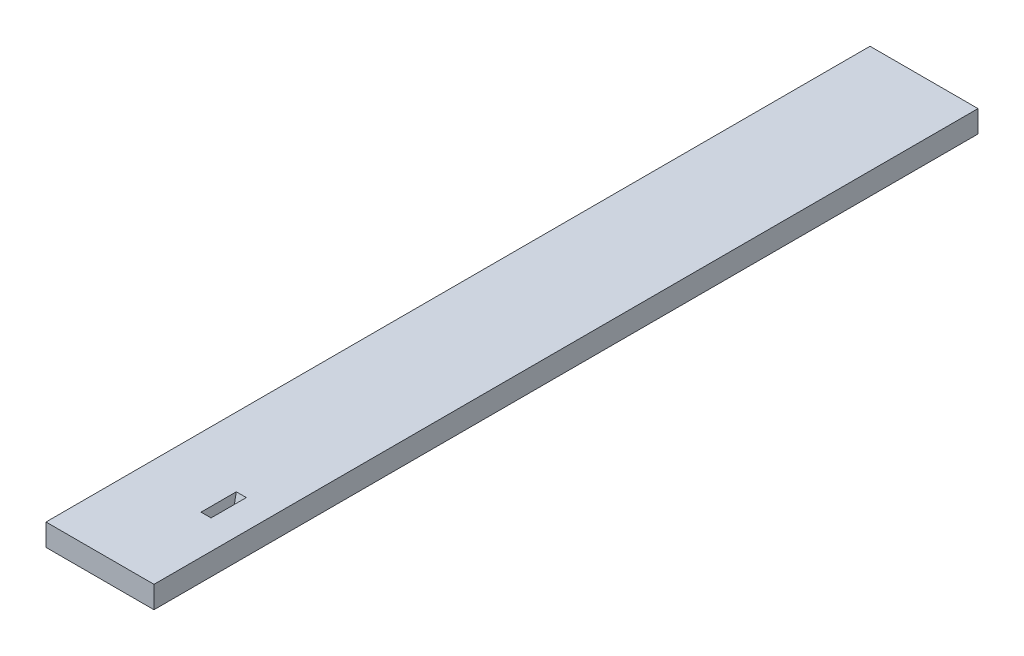
ISO-10303-21;
HEADER;
FILE_DESCRIPTION(('STEP AP214'),'2;1');
FILE_NAME('part.step','',(''),(''),'','','');
FILE_SCHEMA(('AUTOMOTIVE_DESIGN { 1 0 10303 214 1 1 1 1 }'));
ENDSEC;
DATA;
#1=APPLICATION_CONTEXT('core data for automotive mechanical design processes');
#2=APPLICATION_PROTOCOL_DEFINITION('international standard','automotive_design',2000,#1);
#3=PRODUCT_CONTEXT('',#1,'mechanical');
#4=PRODUCT('Part','Part','',(#3));
#5=PRODUCT_RELATED_PRODUCT_CATEGORY('part','',(#4));
#6=PRODUCT_DEFINITION_FORMATION('','',#4);
#7=PRODUCT_DEFINITION_CONTEXT('part definition',#1,'design');
#8=PRODUCT_DEFINITION('design','',#6,#7);
#9=PRODUCT_DEFINITION_SHAPE('','',#8);
#10=(LENGTH_UNIT() NAMED_UNIT(*) SI_UNIT(.MILLI.,.METRE.));
#11=(NAMED_UNIT(*) PLANE_ANGLE_UNIT() SI_UNIT($,.RADIAN.));
#12=(NAMED_UNIT(*) SI_UNIT($,.STERADIAN.) SOLID_ANGLE_UNIT());
#13=UNCERTAINTY_MEASURE_WITH_UNIT(LENGTH_MEASURE(1.E-05),#10,'distance_accuracy_value','');
#14=(GEOMETRIC_REPRESENTATION_CONTEXT(3) GLOBAL_UNCERTAINTY_ASSIGNED_CONTEXT((#13)) GLOBAL_UNIT_ASSIGNED_CONTEXT((#10,
#11,#12)) REPRESENTATION_CONTEXT('',''));
#15=CARTESIAN_POINT('',(0.,0.,0.));
#16=DIRECTION('',(0.,0.,1.));
#17=DIRECTION('',(1.,0.,0.));
#18=AXIS2_PLACEMENT_3D('',#15,#16,#17);
#19=CARTESIAN_POINT('',(98.0000000000001,0.,-745.709506602965));
#20=DIRECTION('',(0.,1.,0.));
#21=DIRECTION('',(0.,0.,1.));
#22=AXIS2_PLACEMENT_3D('',#19,#20,#21);
#23=PLANE('',#22);
#24=DIRECTION('',(0.,0.,-1.));
#25=VECTOR('',#24,1.);
#26=CARTESIAN_POINT('',(98.0000000000001,0.,750.));
#27=LINE('',#26,#25);
#28=CARTESIAN_POINT('',(98.0000000000001,0.,750.));
#29=VERTEX_POINT('',#28);
#30=CARTESIAN_POINT('',(98.0000000000001,0.,-745.709506602965));
#31=VERTEX_POINT('',#30);
#32=EDGE_CURVE('E128',#29,#31,#27,.T.);
#33=ORIENTED_EDGE('',*,*,#32,.F.);
#34=DIRECTION('',(1.,0.,0.));
#35=VECTOR('',#34,1.);
#36=CARTESIAN_POINT('',(98.0000000000001,0.,750.));
#37=LINE('',#36,#35);
#38=CARTESIAN_POINT('',(-98.0000000000001,0.,750.));
#39=VERTEX_POINT('',#38);
#40=EDGE_CURVE('E138',#39,#29,#37,.T.);
#41=ORIENTED_EDGE('',*,*,#40,.F.);
#42=DIRECTION('',(0.,0.,1.));
#43=VECTOR('',#42,1.);
#44=CARTESIAN_POINT('',(-98.0000000000001,0.,750.));
#45=LINE('',#44,#43);
#46=CARTESIAN_POINT('',(-98.0000000000001,0.,-745.709506602965));
#47=VERTEX_POINT('',#46);
#48=EDGE_CURVE('E135',#47,#39,#45,.T.);
#49=ORIENTED_EDGE('',*,*,#48,.F.);
#50=DIRECTION('',(-1.,0.,0.));
#51=VECTOR('',#50,1.);
#52=CARTESIAN_POINT('',(98.0000000000001,0.,-745.709506602965));
#53=LINE('',#52,#51);
#54=EDGE_CURVE('E131',#31,#47,#53,.T.);
#55=ORIENTED_EDGE('',*,*,#54,.F.);
#56=EDGE_LOOP('',(#33,#41,#49,#55));
#57=FACE_BOUND('',#56,.T.);
#58=DIRECTION('',(0.,0.,-1.));
#59=VECTOR('',#58,1.);
#60=CARTESIAN_POINT('',(51.4325031676867,0.,608.781634163193));
#61=LINE('',#60,#59);
#62=CARTESIAN_POINT('',(51.4325031676867,0.,608.781634163193));
#63=VERTEX_POINT('',#62);
#64=CARTESIAN_POINT('',(51.4325031676867,0.,544.737402435618));
#65=VERTEX_POINT('',#64);
#66=EDGE_CURVE('E48',#63,#65,#61,.T.);
#67=ORIENTED_EDGE('',*,*,#66,.T.);
#68=DIRECTION('',(-1.,0.,0.));
#69=VECTOR('',#68,1.);
#70=CARTESIAN_POINT('',(51.4325031676867,0.,544.737402435618));
#71=LINE('',#70,#69);
#72=CARTESIAN_POINT('',(33.2525031676867,0.,544.737402435618));
#73=VERTEX_POINT('',#72);
#74=EDGE_CURVE('E103',#65,#73,#71,.T.);
#75=ORIENTED_EDGE('',*,*,#74,.T.);
#76=DIRECTION('',(0.,0.,1.));
#77=VECTOR('',#76,1.);
#78=CARTESIAN_POINT('',(33.2525031676867,0.,608.781634163193));
#79=LINE('',#78,#77);
#80=CARTESIAN_POINT('',(33.2525031676867,0.,608.781634163193));
#81=VERTEX_POINT('',#80);
#82=EDGE_CURVE('E124',#73,#81,#79,.T.);
#83=ORIENTED_EDGE('',*,*,#82,.T.);
#84=DIRECTION('',(1.,0.,0.));
#85=VECTOR('',#84,1.);
#86=CARTESIAN_POINT('',(51.4325031676867,0.,608.781634163193));
#87=LINE('',#86,#85);
#88=EDGE_CURVE('E120',#81,#63,#87,.T.);
#89=ORIENTED_EDGE('',*,*,#88,.T.);
#90=EDGE_LOOP('',(#67,#75,#83,#89));
#91=FACE_BOUND('',#90,.T.);
#92=ADVANCED_FACE('F31',(#57,#91),#23,.F.);
#93=CARTESIAN_POINT('',(98.0000000000001,40.,-745.709506602965));
#94=DIRECTION('',(0.,1.,0.));
#95=DIRECTION('',(0.,0.,1.));
#96=AXIS2_PLACEMENT_3D('',#93,#94,#95);
#97=PLANE('',#96);
#98=DIRECTION('',(0.,0.,-1.));
#99=VECTOR('',#98,1.);
#100=CARTESIAN_POINT('',(98.0000000000001,40.,750.));
#101=LINE('',#100,#99);
#102=CARTESIAN_POINT('',(98.0000000000001,40.,750.));
#103=VERTEX_POINT('',#102);
#104=CARTESIAN_POINT('',(98.0000000000001,40.,-745.709506602965));
#105=VERTEX_POINT('',#104);
#106=EDGE_CURVE('E116',#103,#105,#101,.T.);
#107=ORIENTED_EDGE('',*,*,#106,.T.);
#108=DIRECTION('',(-1.,0.,0.));
#109=VECTOR('',#108,1.);
#110=CARTESIAN_POINT('',(98.0000000000001,40.,-745.709506602965));
#111=LINE('',#110,#109);
#112=CARTESIAN_POINT('',(-98.0000000000001,40.,-745.709506602965));
#113=VERTEX_POINT('',#112);
#114=EDGE_CURVE('E143',#105,#113,#111,.T.);
#115=ORIENTED_EDGE('',*,*,#114,.T.);
#116=DIRECTION('',(0.,0.,1.));
#117=VECTOR('',#116,1.);
#118=CARTESIAN_POINT('',(-98.0000000000001,40.,750.));
#119=LINE('',#118,#117);
#120=CARTESIAN_POINT('',(-98.0000000000001,40.,750.));
#121=VERTEX_POINT('',#120);
#122=EDGE_CURVE('E146',#113,#121,#119,.T.);
#123=ORIENTED_EDGE('',*,*,#122,.T.);
#124=DIRECTION('',(1.,0.,0.));
#125=VECTOR('',#124,1.);
#126=CARTESIAN_POINT('',(98.0000000000001,40.,750.));
#127=LINE('',#126,#125);
#128=EDGE_CURVE('E132',#121,#103,#127,.T.);
#129=ORIENTED_EDGE('',*,*,#128,.T.);
#130=EDGE_LOOP('',(#107,#115,#123,#129));
#131=FACE_BOUND('',#130,.T.);
#132=DIRECTION('',(-1.,0.,0.));
#133=VECTOR('',#132,1.);
#134=CARTESIAN_POINT('',(35.8071316836503,40.,529.80550343344));
#135=LINE('',#134,#133);
#136=CARTESIAN_POINT('',(45.4325031676867,40.,529.80550343344));
#137=VERTEX_POINT('',#136);
#138=CARTESIAN_POINT('',(27.2525031676867,40.,529.80550343344));
#139=VERTEX_POINT('',#138);
#140=EDGE_CURVE('E101',#137,#139,#135,.T.);
#141=ORIENTED_EDGE('',*,*,#140,.F.);
#142=DIRECTION('',(0.,0.,-1.));
#143=VECTOR('',#142,1.);
#144=CARTESIAN_POINT('',(45.4325031676867,40.,569.895556018001));
#145=LINE('',#144,#143);
#146=CARTESIAN_POINT('',(45.4325031676867,40.,593.849735161015));
#147=VERTEX_POINT('',#146);
#148=EDGE_CURVE('E106',#147,#137,#145,.T.);
#149=ORIENTED_EDGE('',*,*,#148,.F.);
#150=DIRECTION('',(1.,0.,0.));
#151=VECTOR('',#150,1.);
#152=CARTESIAN_POINT('',(35.8071316836503,40.,593.849735161015));
#153=LINE('',#152,#151);
#154=CARTESIAN_POINT('',(27.2525031676867,40.,593.849735161015));
#155=VERTEX_POINT('',#154);
#156=EDGE_CURVE('E112',#155,#147,#153,.T.);
#157=ORIENTED_EDGE('',*,*,#156,.F.);
#158=DIRECTION('',(0.,0.,1.));
#159=VECTOR('',#158,1.);
#160=CARTESIAN_POINT('',(27.2525031676867,40.,569.895556018001));
#161=LINE('',#160,#159);
#162=EDGE_CURVE('E56',#139,#155,#161,.T.);
#163=ORIENTED_EDGE('',*,*,#162,.F.);
#164=EDGE_LOOP('',(#141,#149,#157,#163));
#165=FACE_BOUND('',#164,.T.);
#166=ADVANCED_FACE('F114',(#131,#165),#97,.T.);
#167=CARTESIAN_POINT('',(98.0000000000001,0.,750.));
#168=DIRECTION('',(1.,0.,0.));
#169=DIRECTION('',(0.,0.,-1.));
#170=AXIS2_PLACEMENT_3D('',#167,#168,#169);
#171=PLANE('',#170);
#172=ORIENTED_EDGE('',*,*,#106,.F.);
#173=DIRECTION('',(0.,1.,0.));
#174=VECTOR('',#173,1.);
#175=CARTESIAN_POINT('',(98.0000000000001,0.,750.));
#176=LINE('',#175,#174);
#177=EDGE_CURVE('E11',#29,#103,#176,.T.);
#178=ORIENTED_EDGE('',*,*,#177,.F.);
#179=ORIENTED_EDGE('',*,*,#32,.T.);
#180=DIRECTION('',(0.,1.,0.));
#181=VECTOR('',#180,1.);
#182=CARTESIAN_POINT('',(98.0000000000001,0.,-745.709506602965));
#183=LINE('',#182,#181);
#184=EDGE_CURVE('E35',#31,#105,#183,.T.);
#185=ORIENTED_EDGE('',*,*,#184,.T.);
#186=EDGE_LOOP('',(#172,#178,#179,#185));
#187=FACE_BOUND('',#186,.T.);
#188=ADVANCED_FACE('F33',(#187),#171,.T.);
#189=CARTESIAN_POINT('',(98.0000000000001,0.,750.));
#190=DIRECTION('',(0.,0.,1.));
#191=DIRECTION('',(1.,0.,0.));
#192=AXIS2_PLACEMENT_3D('',#189,#190,#191);
#193=PLANE('',#192);
#194=ORIENTED_EDGE('',*,*,#128,.F.);
#195=DIRECTION('',(0.,1.,0.));
#196=VECTOR('',#195,1.);
#197=CARTESIAN_POINT('',(-98.0000000000001,0.,750.));
#198=LINE('',#197,#196);
#199=EDGE_CURVE('E40',#39,#121,#198,.T.);
#200=ORIENTED_EDGE('',*,*,#199,.F.);
#201=ORIENTED_EDGE('',*,*,#40,.T.);
#202=ORIENTED_EDGE('',*,*,#177,.T.);
#203=EDGE_LOOP('',(#194,#200,#201,#202));
#204=FACE_BOUND('',#203,.T.);
#205=ADVANCED_FACE('F163',(#204),#193,.T.);
#206=CARTESIAN_POINT('',(-98.0000000000001,0.,750.));
#207=DIRECTION('',(-1.,0.,0.));
#208=DIRECTION('',(0.,0.,1.));
#209=AXIS2_PLACEMENT_3D('',#206,#207,#208);
#210=PLANE('',#209);
#211=ORIENTED_EDGE('',*,*,#122,.F.);
#212=DIRECTION('',(0.,1.,0.));
#213=VECTOR('',#212,1.);
#214=CARTESIAN_POINT('',(-98.0000000000001,0.,-745.709506602965));
#215=LINE('',#214,#213);
#216=EDGE_CURVE('E151',#47,#113,#215,.T.);
#217=ORIENTED_EDGE('',*,*,#216,.F.);
#218=ORIENTED_EDGE('',*,*,#48,.T.);
#219=ORIENTED_EDGE('',*,*,#199,.T.);
#220=EDGE_LOOP('',(#211,#217,#218,#219));
#221=FACE_BOUND('',#220,.T.);
#222=ADVANCED_FACE('F169',(#221),#210,.T.);
#223=CARTESIAN_POINT('',(98.0000000000001,0.,-745.709506602965));
#224=DIRECTION('',(0.,0.,-1.));
#225=DIRECTION('',(-1.,0.,0.));
#226=AXIS2_PLACEMENT_3D('',#223,#224,#225);
#227=PLANE('',#226);
#228=ORIENTED_EDGE('',*,*,#114,.F.);
#229=ORIENTED_EDGE('',*,*,#184,.F.);
#230=ORIENTED_EDGE('',*,*,#54,.T.);
#231=ORIENTED_EDGE('',*,*,#216,.T.);
#232=EDGE_LOOP('',(#228,#229,#230,#231));
#233=FACE_BOUND('',#232,.T.);
#234=ADVANCED_FACE('F159',(#233),#227,.T.);
#235=CARTESIAN_POINT('',(35.8071316836503,104.169143226909,569.895556018001));
#236=DIRECTION('',(-0.988936352868298,-0.148340452930245,0.));
#237=DIRECTION('',(0.148340452930245,-0.988936352868298,0.));
#238=AXIS2_PLACEMENT_3D('',#235,#236,#237);
#239=PLANE('',#238);
#240=ORIENTED_EDGE('',*,*,#148,.T.);
#241=DIRECTION('',(0.139160519096273,-0.92773679397515,0.346321802706048));
#242=VECTOR('',#241,1.);
#243=CARTESIAN_POINT('',(35.8071316836503,104.169143226909,505.851324290426));
#244=LINE('',#243,#242);
#245=EDGE_CURVE('E97',#137,#65,#244,.T.);
#246=ORIENTED_EDGE('',*,*,#245,.T.);
#247=ORIENTED_EDGE('',*,*,#66,.F.);
#248=DIRECTION('',(0.139160519096273,-0.92773679397515,0.346321802706048));
#249=VECTOR('',#248,1.);
#250=CARTESIAN_POINT('',(35.8071316836503,104.169143226909,569.895556018001));
#251=LINE('',#250,#249);
#252=EDGE_CURVE('E108',#147,#63,#251,.T.);
#253=ORIENTED_EDGE('',*,*,#252,.F.);
#254=EDGE_LOOP('',(#240,#246,#247,#253));
#255=FACE_BOUND('',#254,.T.);
#256=ADVANCED_FACE('F107',(#255),#239,.T.);
#257=CARTESIAN_POINT('',(35.8071316836503,104.169143226909,505.851324290426));
#258=DIRECTION('',(0.,0.349724680882138,0.936852521788721));
#259=DIRECTION('',(0.,-0.936852521788721,0.349724680882138));
#260=AXIS2_PLACEMENT_3D('',#257,#258,#259);
#261=PLANE('',#260);
#262=ORIENTED_EDGE('',*,*,#140,.T.);
#263=DIRECTION('',(0.139160519096273,-0.92773679397515,0.346321802706048));
#264=VECTOR('',#263,1.);
#265=CARTESIAN_POINT('',(17.6271316836502,104.169143226909,505.851324290426));
#266=LINE('',#265,#264);
#267=EDGE_CURVE('E122',#139,#73,#266,.T.);
#268=ORIENTED_EDGE('',*,*,#267,.T.);
#269=ORIENTED_EDGE('',*,*,#74,.F.);
#270=ORIENTED_EDGE('',*,*,#245,.F.);
#271=EDGE_LOOP('',(#262,#268,#269,#270));
#272=FACE_BOUND('',#271,.T.);
#273=ADVANCED_FACE('F99',(#272),#261,.T.);
#274=CARTESIAN_POINT('',(17.6271316836502,104.169143226909,569.895556018001));
#275=DIRECTION('',(0.988936352868298,0.148340452930245,0.));
#276=DIRECTION('',(-0.148340452930245,0.988936352868298,0.));
#277=AXIS2_PLACEMENT_3D('',#274,#275,#276);
#278=PLANE('',#277);
#279=ORIENTED_EDGE('',*,*,#162,.T.);
#280=DIRECTION('',(0.139160519096273,-0.92773679397515,0.346321802706048));
#281=VECTOR('',#280,1.);
#282=CARTESIAN_POINT('',(17.6271316836502,104.169143226909,569.895556018001));
#283=LINE('',#282,#281);
#284=EDGE_CURVE('E125',#155,#81,#283,.T.);
#285=ORIENTED_EDGE('',*,*,#284,.T.);
#286=ORIENTED_EDGE('',*,*,#82,.F.);
#287=ORIENTED_EDGE('',*,*,#267,.F.);
#288=EDGE_LOOP('',(#279,#285,#286,#287));
#289=FACE_BOUND('',#288,.T.);
#290=ADVANCED_FACE('F188',(#289),#278,.T.);
#291=CARTESIAN_POINT('',(35.8071316836503,104.169143226909,569.895556018001));
#292=DIRECTION('',(0.,-0.349724680882138,-0.936852521788721));
#293=DIRECTION('',(0.,0.936852521788721,-0.349724680882138));
#294=AXIS2_PLACEMENT_3D('',#291,#292,#293);
#295=PLANE('',#294);
#296=ORIENTED_EDGE('',*,*,#156,.T.);
#297=ORIENTED_EDGE('',*,*,#252,.T.);
#298=ORIENTED_EDGE('',*,*,#88,.F.);
#299=ORIENTED_EDGE('',*,*,#284,.F.);
#300=EDGE_LOOP('',(#296,#297,#298,#299));
#301=FACE_BOUND('',#300,.T.);
#302=ADVANCED_FACE('F191',(#301),#295,.T.);
#303=CLOSED_SHELL('',(#92,#166,#188,#205,#222,#234,#256,#273,#290,#302));
#304=MANIFOLD_SOLID_BREP('B2',#303);
#305=ADVANCED_BREP_SHAPE_REPRESENTATION('',(#18,#304),#14);
#306=SHAPE_DEFINITION_REPRESENTATION(#9,#305);
ENDSEC;
END-ISO-10303-21;
